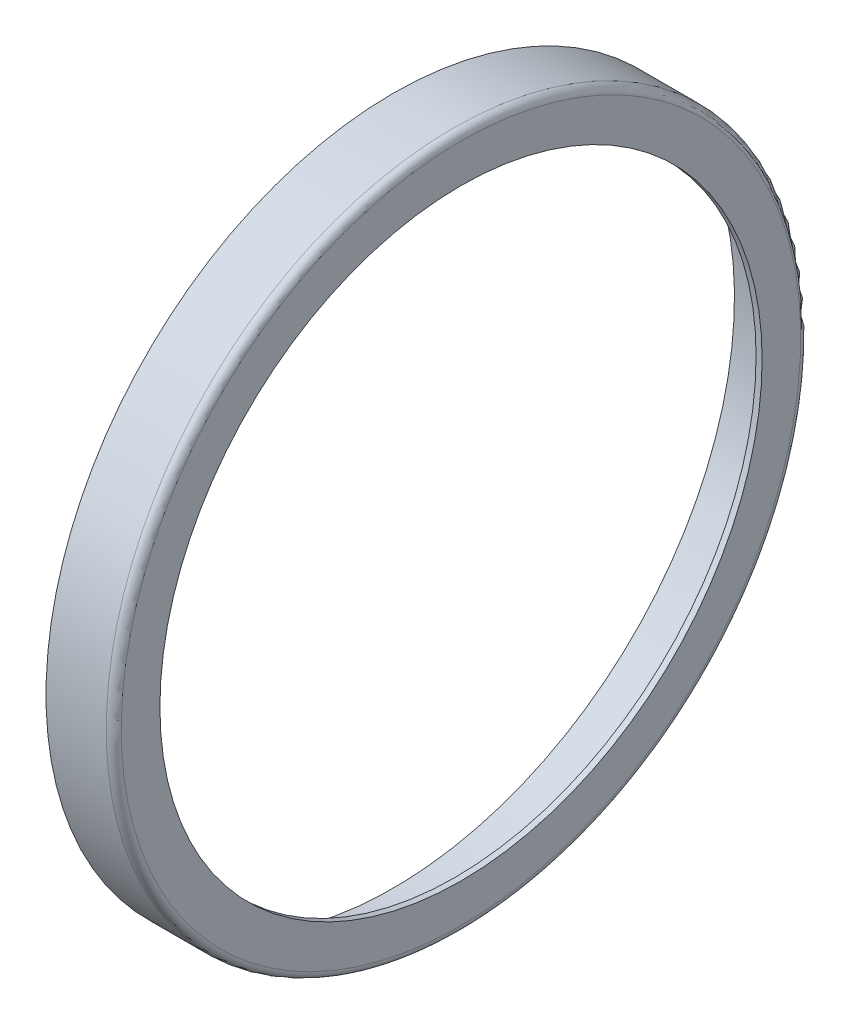
ISO-10303-21;
HEADER;
FILE_DESCRIPTION(('STEP AP214'),'2;1');
FILE_NAME('part.step','',(''),(''),'','','');
FILE_SCHEMA(('AUTOMOTIVE_DESIGN { 1 0 10303 214 1 1 1 1 }'));
ENDSEC;
DATA;
#1=APPLICATION_CONTEXT('core data for automotive mechanical design processes');
#2=APPLICATION_PROTOCOL_DEFINITION('international standard','automotive_design',2000,#1);
#3=PRODUCT_CONTEXT('',#1,'mechanical');
#4=PRODUCT('Part','Part','',(#3));
#5=PRODUCT_RELATED_PRODUCT_CATEGORY('part','',(#4));
#6=PRODUCT_DEFINITION_FORMATION('','',#4);
#7=PRODUCT_DEFINITION_CONTEXT('part definition',#1,'design');
#8=PRODUCT_DEFINITION('design','',#6,#7);
#9=PRODUCT_DEFINITION_SHAPE('','',#8);
#10=(LENGTH_UNIT() NAMED_UNIT(*) SI_UNIT(.MILLI.,.METRE.));
#11=(NAMED_UNIT(*) PLANE_ANGLE_UNIT() SI_UNIT($,.RADIAN.));
#12=(NAMED_UNIT(*) SI_UNIT($,.STERADIAN.) SOLID_ANGLE_UNIT());
#13=UNCERTAINTY_MEASURE_WITH_UNIT(LENGTH_MEASURE(1.E-05),#10,'distance_accuracy_value','');
#14=(GEOMETRIC_REPRESENTATION_CONTEXT(3) GLOBAL_UNCERTAINTY_ASSIGNED_CONTEXT((#13)) GLOBAL_UNIT_ASSIGNED_CONTEXT((#10,
#11,#12)) REPRESENTATION_CONTEXT('',''));
#15=CARTESIAN_POINT('',(0.,0.,0.));
#16=DIRECTION('',(0.,0.,1.));
#17=DIRECTION('',(1.,0.,0.));
#18=AXIS2_PLACEMENT_3D('',#15,#16,#17);
#19=CARTESIAN_POINT('',(27.8,0.,0.));
#20=DIRECTION('',(-1.,0.,0.));
#21=DIRECTION('',(0.,1.,0.));
#22=AXIS2_PLACEMENT_3D('',#19,#20,#21);
#23=CYLINDRICAL_SURFACE('',#22,20.);
#24=CARTESIAN_POINT('',(28.,0.,0.));
#25=DIRECTION('',(1.,0.,0.));
#26=DIRECTION('',(0.,1.,0.));
#27=AXIS2_PLACEMENT_3D('',#24,#25,#26);
#28=CIRCLE('',#27,20.);
#29=CARTESIAN_POINT('',(28.,20.,0.));
#30=VERTEX_POINT('',#29);
#31=EDGE_CURVE('E11',#30,#30,#28,.T.);
#32=ORIENTED_EDGE('',*,*,#31,.T.);
#33=EDGE_LOOP('',(#32));
#34=FACE_BOUND('',#33,.T.);
#35=CARTESIAN_POINT('',(27.6,0.,0.));
#36=DIRECTION('',(1.,0.,0.));
#37=DIRECTION('',(0.,1.,0.));
#38=AXIS2_PLACEMENT_3D('',#35,#36,#37);
#39=CIRCLE('',#38,20.);
#40=CARTESIAN_POINT('',(27.6,20.,0.));
#41=VERTEX_POINT('',#40);
#42=EDGE_CURVE('E61',#41,#41,#39,.T.);
#43=ORIENTED_EDGE('',*,*,#42,.F.);
#44=EDGE_LOOP('',(#43));
#45=FACE_BOUND('',#44,.T.);
#46=ADVANCED_FACE('F17',(#34,#45),#23,.F.);
#47=CARTESIAN_POINT('',(28.,21.2825,0.));
#48=DIRECTION('',(1.,0.,0.));
#49=DIRECTION('',(0.,1.,0.));
#50=AXIS2_PLACEMENT_3D('',#47,#48,#49);
#51=PLANE('',#50);
#52=CARTESIAN_POINT('',(28.,0.,0.));
#53=DIRECTION('',(1.,0.,0.));
#54=DIRECTION('',(0.,1.,0.));
#55=AXIS2_PLACEMENT_3D('',#52,#53,#54);
#56=CIRCLE('',#55,22.565);
#57=CARTESIAN_POINT('',(28.,22.565,0.));
#58=VERTEX_POINT('',#57);
#59=EDGE_CURVE('E27',#58,#58,#56,.T.);
#60=ORIENTED_EDGE('',*,*,#59,.T.);
#61=EDGE_LOOP('',(#60));
#62=FACE_BOUND('',#61,.T.);
#63=ORIENTED_EDGE('',*,*,#31,.F.);
#64=EDGE_LOOP('',(#63));
#65=FACE_BOUND('',#64,.T.);
#66=ADVANCED_FACE('F75',(#62,#65),#51,.T.);
#67=CARTESIAN_POINT('',(27.5,0.,0.));
#68=DIRECTION('',(1.,0.,0.));
#69=DIRECTION('',(0.,0.,-1.));
#70=AXIS2_PLACEMENT_3D('',#67,#68,#69);
#71=TOROIDAL_SURFACE('',#70,22.565,0.5);
#72=CARTESIAN_POINT('',(27.5,0.,0.));
#73=DIRECTION('',(1.,0.,0.));
#74=DIRECTION('',(0.,1.,0.));
#75=AXIS2_PLACEMENT_3D('',#72,#73,#74);
#76=CIRCLE('',#75,23.065);
#77=CARTESIAN_POINT('',(27.5,23.065,0.));
#78=VERTEX_POINT('',#77);
#79=EDGE_CURVE('E21',#78,#78,#76,.T.);
#80=ORIENTED_EDGE('',*,*,#79,.T.);
#81=EDGE_LOOP('',(#80));
#82=FACE_BOUND('',#81,.T.);
#83=ORIENTED_EDGE('',*,*,#59,.F.);
#84=EDGE_LOOP('',(#83));
#85=FACE_BOUND('',#84,.T.);
#86=ADVANCED_FACE('F78',(#82,#85),#71,.T.);
#87=CARTESIAN_POINT('',(25.5,0.,0.));
#88=DIRECTION('',(-1.,0.,0.));
#89=DIRECTION('',(0.,1.,0.));
#90=AXIS2_PLACEMENT_3D('',#87,#88,#89);
#91=CYLINDRICAL_SURFACE('',#90,23.065);
#92=CARTESIAN_POINT('',(23.5,0.,0.));
#93=DIRECTION('',(1.,0.,0.));
#94=DIRECTION('',(0.,1.,0.));
#95=AXIS2_PLACEMENT_3D('',#92,#93,#94);
#96=CIRCLE('',#95,23.065);
#97=CARTESIAN_POINT('',(23.5,23.065,0.));
#98=VERTEX_POINT('',#97);
#99=EDGE_CURVE('E66',#98,#98,#96,.T.);
#100=ORIENTED_EDGE('',*,*,#99,.T.);
#101=EDGE_LOOP('',(#100));
#102=FACE_BOUND('',#101,.T.);
#103=ORIENTED_EDGE('',*,*,#79,.F.);
#104=EDGE_LOOP('',(#103));
#105=FACE_BOUND('',#104,.T.);
#106=ADVANCED_FACE('F19',(#102,#105),#91,.T.);
#107=CARTESIAN_POINT('',(23.5,22.865,0.));
#108=DIRECTION('',(-1.,0.,0.));
#109=DIRECTION('',(0.,-1.,0.));
#110=AXIS2_PLACEMENT_3D('',#107,#108,#109);
#111=PLANE('',#110);
#112=CARTESIAN_POINT('',(23.5,0.,0.));
#113=DIRECTION('',(1.,0.,0.));
#114=DIRECTION('',(0.,1.,0.));
#115=AXIS2_PLACEMENT_3D('',#112,#113,#114);
#116=CIRCLE('',#115,22.665);
#117=CARTESIAN_POINT('',(23.5,22.665,0.));
#118=VERTEX_POINT('',#117);
#119=EDGE_CURVE('E43',#118,#118,#116,.T.);
#120=ORIENTED_EDGE('',*,*,#119,.T.);
#121=EDGE_LOOP('',(#120));
#122=FACE_BOUND('',#121,.T.);
#123=ORIENTED_EDGE('',*,*,#99,.F.);
#124=EDGE_LOOP('',(#123));
#125=FACE_BOUND('',#124,.T.);
#126=ADVANCED_FACE('F86',(#122,#125),#111,.T.);
#127=CARTESIAN_POINT('',(25.425,0.,0.));
#128=DIRECTION('',(-1.,0.,0.));
#129=DIRECTION('',(0.,1.,0.));
#130=AXIS2_PLACEMENT_3D('',#127,#128,#129);
#131=CYLINDRICAL_SURFACE('',#130,22.665);
#132=CARTESIAN_POINT('',(27.35,0.,0.));
#133=DIRECTION('',(1.,0.,0.));
#134=DIRECTION('',(0.,1.,0.));
#135=AXIS2_PLACEMENT_3D('',#132,#133,#134);
#136=CIRCLE('',#135,22.665);
#137=CARTESIAN_POINT('',(27.35,22.665,0.));
#138=VERTEX_POINT('',#137);
#139=EDGE_CURVE('E50',#138,#138,#136,.T.);
#140=ORIENTED_EDGE('',*,*,#139,.T.);
#141=EDGE_LOOP('',(#140));
#142=FACE_BOUND('',#141,.T.);
#143=ORIENTED_EDGE('',*,*,#119,.F.);
#144=EDGE_LOOP('',(#143));
#145=FACE_BOUND('',#144,.T.);
#146=ADVANCED_FACE('F97',(#142,#145),#131,.F.);
#147=CARTESIAN_POINT('',(27.35,0.,0.));
#148=DIRECTION('',(1.,0.,0.));
#149=DIRECTION('',(0.,0.,-1.));
#150=AXIS2_PLACEMENT_3D('',#147,#148,#149);
#151=TOROIDAL_SURFACE('',#150,22.415,0.25);
#152=CARTESIAN_POINT('',(27.6,0.,0.));
#153=DIRECTION('',(1.,0.,0.));
#154=DIRECTION('',(0.,1.,0.));
#155=AXIS2_PLACEMENT_3D('',#152,#153,#154);
#156=CIRCLE('',#155,22.415);
#157=CARTESIAN_POINT('',(27.6,22.415,0.));
#158=VERTEX_POINT('',#157);
#159=EDGE_CURVE('E57',#158,#158,#156,.T.);
#160=ORIENTED_EDGE('',*,*,#159,.T.);
#161=EDGE_LOOP('',(#160));
#162=FACE_BOUND('',#161,.T.);
#163=ORIENTED_EDGE('',*,*,#139,.F.);
#164=EDGE_LOOP('',(#163));
#165=FACE_BOUND('',#164,.T.);
#166=ADVANCED_FACE('F58',(#162,#165),#151,.F.);
#167=CARTESIAN_POINT('',(27.6,21.2075,0.));
#168=DIRECTION('',(-1.,0.,0.));
#169=DIRECTION('',(0.,-1.,0.));
#170=AXIS2_PLACEMENT_3D('',#167,#168,#169);
#171=PLANE('',#170);
#172=ORIENTED_EDGE('',*,*,#42,.T.);
#173=EDGE_LOOP('',(#172));
#174=FACE_BOUND('',#173,.T.);
#175=ORIENTED_EDGE('',*,*,#159,.F.);
#176=EDGE_LOOP('',(#175));
#177=FACE_BOUND('',#176,.T.);
#178=ADVANCED_FACE('F95',(#174,#177),#171,.T.);
#179=CLOSED_SHELL('',(#46,#66,#86,#106,#126,#146,#166,#178));
#180=MANIFOLD_SOLID_BREP('B1',#179);
#181=ADVANCED_BREP_SHAPE_REPRESENTATION('',(#18,#180),#14);
#182=SHAPE_DEFINITION_REPRESENTATION(#9,#181);
ENDSEC;
END-ISO-10303-21;
